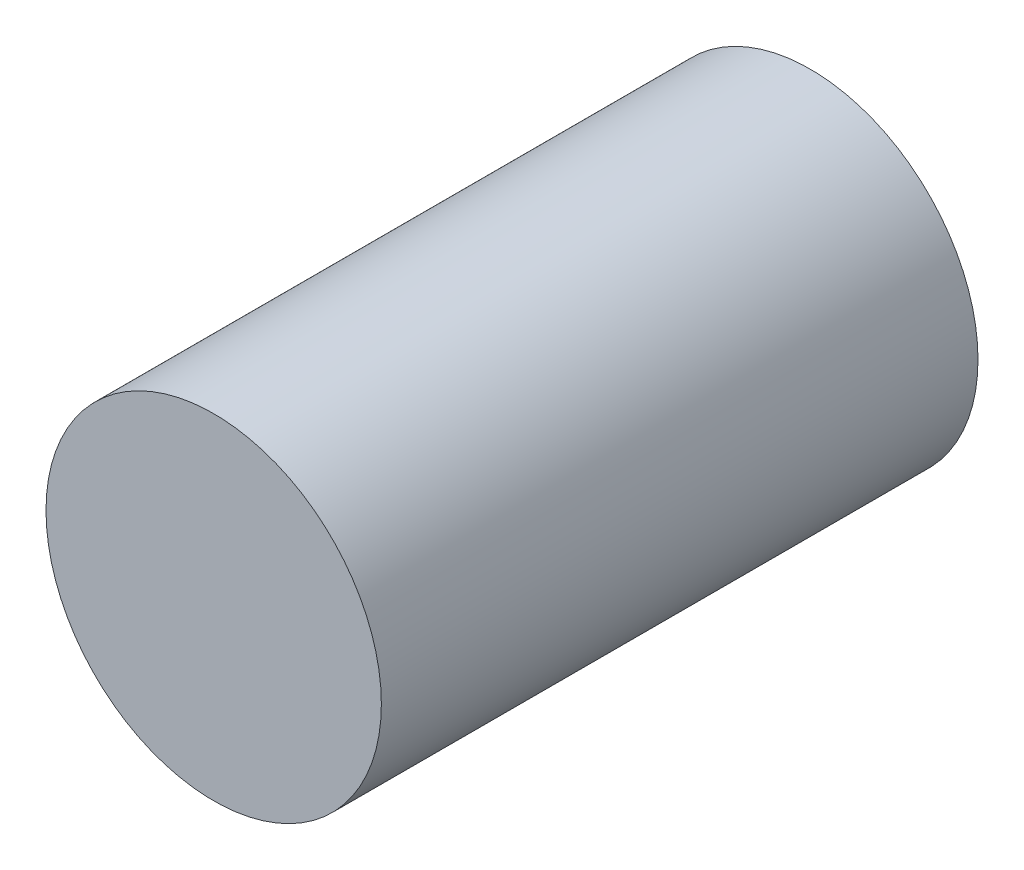
ISO-10303-21;
HEADER;
FILE_DESCRIPTION(('STEP AP214'),'2;1');
FILE_NAME('part.step','',(''),(''),'','','');
FILE_SCHEMA(('AUTOMOTIVE_DESIGN { 1 0 10303 214 1 1 1 1 }'));
ENDSEC;
DATA;
#1=APPLICATION_CONTEXT('core data for automotive mechanical design processes');
#2=APPLICATION_PROTOCOL_DEFINITION('international standard','automotive_design',2000,#1);
#3=PRODUCT_CONTEXT('',#1,'mechanical');
#4=PRODUCT('Part','Part','',(#3));
#5=PRODUCT_RELATED_PRODUCT_CATEGORY('part','',(#4));
#6=PRODUCT_DEFINITION_FORMATION('','',#4);
#7=PRODUCT_DEFINITION_CONTEXT('part definition',#1,'design');
#8=PRODUCT_DEFINITION('design','',#6,#7);
#9=PRODUCT_DEFINITION_SHAPE('','',#8);
#10=(LENGTH_UNIT() NAMED_UNIT(*) SI_UNIT(.MILLI.,.METRE.));
#11=(NAMED_UNIT(*) PLANE_ANGLE_UNIT() SI_UNIT($,.RADIAN.));
#12=(NAMED_UNIT(*) SI_UNIT($,.STERADIAN.) SOLID_ANGLE_UNIT());
#13=UNCERTAINTY_MEASURE_WITH_UNIT(LENGTH_MEASURE(1.E-05),#10,'distance_accuracy_value','');
#14=(GEOMETRIC_REPRESENTATION_CONTEXT(3) GLOBAL_UNCERTAINTY_ASSIGNED_CONTEXT((#13)) GLOBAL_UNIT_ASSIGNED_CONTEXT((#10,
#11,#12)) REPRESENTATION_CONTEXT('',''));
#15=CARTESIAN_POINT('',(0.,0.,0.));
#16=DIRECTION('',(0.,0.,1.));
#17=DIRECTION('',(1.,0.,0.));
#18=AXIS2_PLACEMENT_3D('',#15,#16,#17);
#19=CARTESIAN_POINT('',(0.,0.,13.5207248326412));
#20=DIRECTION('',(0.,0.,-1.));
#21=DIRECTION('',(-1.,0.,0.));
#22=AXIS2_PLACEMENT_3D('',#19,#20,#21);
#23=CYLINDRICAL_SURFACE('',#22,3.8);
#24=CARTESIAN_POINT('',(0.,0.,13.5207248326412));
#25=DIRECTION('',(0.,0.,1.));
#26=DIRECTION('',(1.,0.,0.));
#27=AXIS2_PLACEMENT_3D('',#24,#25,#26);
#28=CIRCLE('',#27,3.8);
#29=CARTESIAN_POINT('',(-3.8,0.,13.5207248326412));
#30=VERTEX_POINT('',#29);
#31=EDGE_CURVE('E10',#30,#30,#28,.T.);
#32=CARTESIAN_POINT('',(0.,0.,0.));
#33=DIRECTION('',(0.,0.,1.));
#34=DIRECTION('',(1.,0.,0.));
#35=AXIS2_PLACEMENT_3D('',#32,#33,#34);
#36=CIRCLE('',#35,3.8);
#37=CARTESIAN_POINT('',(-3.8,0.,0.));
#38=VERTEX_POINT('',#37);
#39=EDGE_CURVE('E40',#38,#38,#36,.T.);
#40=CARTESIAN_POINT('',(-3.8,0.,13.5207248326412));
#41=CARTESIAN_POINT('',(-3.8,0.,13.3798839489678));
#42=CARTESIAN_POINT('',(-3.8,0.,13.2390430652945));
#43=CARTESIAN_POINT('',(-3.8,0.,12.9573612979478));
#44=CARTESIAN_POINT('',(-3.8,0.,12.8165204142745));
#45=CARTESIAN_POINT('',(-3.8,0.,12.5348386469278));
#46=CARTESIAN_POINT('',(-3.8,0.,12.3939977632544));
#47=CARTESIAN_POINT('',(-3.8,0.,12.1123159959077));
#48=CARTESIAN_POINT('',(-3.8,0.,11.9714751122344));
#49=CARTESIAN_POINT('',(-3.8,0.,11.6897933448877));
#50=CARTESIAN_POINT('',(-3.8,0.,11.5489524612143));
#51=CARTESIAN_POINT('',(-3.8,0.,11.2672706938676));
#52=CARTESIAN_POINT('',(-3.8,0.,11.1264298101943));
#53=CARTESIAN_POINT('',(-3.8,0.,10.8447480428476));
#54=CARTESIAN_POINT('',(-3.8,0.,10.7039071591743));
#55=CARTESIAN_POINT('',(-3.8,0.,10.4222253918276));
#56=CARTESIAN_POINT('',(-3.8,0.,10.2813845081542));
#57=CARTESIAN_POINT('',(-3.8,0.,9.99970274080754));
#58=CARTESIAN_POINT('',(-3.8,0.,9.85886185713419));
#59=CARTESIAN_POINT('',(-3.8,0.,9.5771800897875));
#60=CARTESIAN_POINT('',(-3.8,0.,9.43633920611416));
#61=CARTESIAN_POINT('',(-3.8,0.,9.15465743876746));
#62=CARTESIAN_POINT('',(-3.8,0.,9.01381655509412));
#63=CARTESIAN_POINT('',(-3.8,0.,8.73213478774743));
#64=CARTESIAN_POINT('',(-3.8,0.,8.59129390407408));
#65=CARTESIAN_POINT('',(-3.8,0.,8.30961213672739));
#66=CARTESIAN_POINT('',(-3.8,0.,8.16877125305404));
#67=CARTESIAN_POINT('',(-3.8,0.,7.88708948570735));
#68=CARTESIAN_POINT('',(-3.8,0.,7.74624860203401));
#69=CARTESIAN_POINT('',(-3.8,0.,7.46456683468732));
#70=CARTESIAN_POINT('',(-3.8,0.,7.32372595101397));
#71=CARTESIAN_POINT('',(-3.8,0.,7.04204418366728));
#72=CARTESIAN_POINT('',(-3.8,0.,6.90120329999393));
#73=CARTESIAN_POINT('',(-3.8,0.,6.61952153264724));
#74=CARTESIAN_POINT('',(-3.8,0.,6.4786806489739));
#75=CARTESIAN_POINT('',(-3.8,0.,6.1969988816272));
#76=CARTESIAN_POINT('',(-3.8,0.,6.05615799795386));
#77=CARTESIAN_POINT('',(-3.8,0.,5.77447623060717));
#78=CARTESIAN_POINT('',(-3.8,0.,5.63363534693382));
#79=CARTESIAN_POINT('',(-3.8,0.,5.35195357958713));
#80=CARTESIAN_POINT('',(-3.8,0.,5.21111269591379));
#81=CARTESIAN_POINT('',(-3.8,0.,4.9294309285671));
#82=CARTESIAN_POINT('',(-3.8,0.,4.78859004489375));
#83=CARTESIAN_POINT('',(-3.8,0.,4.50690827754706));
#84=CARTESIAN_POINT('',(-3.8,0.,4.36606739387371));
#85=CARTESIAN_POINT('',(-3.8,0.,4.08438562652702));
#86=CARTESIAN_POINT('',(-3.8,0.,3.94354474285368));
#87=CARTESIAN_POINT('',(-3.8,0.,3.66186297550698));
#88=CARTESIAN_POINT('',(-3.8,0.,3.52102209183364));
#89=CARTESIAN_POINT('',(-3.8,0.,3.23934032448695));
#90=CARTESIAN_POINT('',(-3.8,0.,3.0984994408136));
#91=CARTESIAN_POINT('',(-3.8,0.,2.81681767346691));
#92=CARTESIAN_POINT('',(-3.8,0.,2.67597678979357));
#93=CARTESIAN_POINT('',(-3.8,0.,2.39429502244687));
#94=CARTESIAN_POINT('',(-3.8,0.,2.25345413877353));
#95=CARTESIAN_POINT('',(-3.8,0.,1.97177237142684));
#96=CARTESIAN_POINT('',(-3.8,0.,1.83093148775349));
#97=CARTESIAN_POINT('',(-3.8,0.,1.5492497204068));
#98=CARTESIAN_POINT('',(-3.8,0.,1.40840883673346));
#99=CARTESIAN_POINT('',(-3.8,0.,1.12672706938676));
#100=CARTESIAN_POINT('',(-3.8,0.,0.985886185713418));
#101=CARTESIAN_POINT('',(-3.8,0.,0.704204418366727));
#102=CARTESIAN_POINT('',(-3.8,0.,0.563363534693381));
#103=CARTESIAN_POINT('',(-3.8,0.,0.281681767346689));
#104=CARTESIAN_POINT('',(-3.8,0.,0.140840883673344));
#105=CARTESIAN_POINT('',(-3.8,0.,0.));
#106=B_SPLINE_CURVE_WITH_KNOTS('',3,(#40,#41,#42,#43,#44,#45,#46,#47,#48,#49,#50,#51,#52,#53,
#54,#55,#56,#57,#58,#59,#60,#61,#62,#63,#64,#65,#66,#67,#68,#69,#70,#71,#72,#73,#74,#75,#76,#77,
#78,#79,#80,#81,#82,#83,#84,#85,#86,#87,#88,#89,#90,#91,#92,#93,#94,#95,#96,#97,#98,#99,#100,
#101,#102,#103,#104,#105),.UNSPECIFIED.,.F.,.F.,(4,2,2,2,2,2,2,2,2,2,2,2,2,2,2,2,2,2,2,2,2,2,2,
2,2,2,2,2,2,2,2,2,4),(0.,0.422522651020038,0.845045302040074,1.26756795306011,1.69009060408015,
2.11261325510019,2.53513590612022,2.95765855714026,3.3801812081603,3.80270385918033,
4.22522651020037,4.64774916122041,5.07027181224044,5.49279446326048,5.91531711428052,
6.33783976530055,6.76036241632059,7.18288506734063,7.60540771836067,8.0279303693807,
8.45045302040074,8.87297567142078,9.29549832244081,9.71802097346085,10.1405436244809,
10.5630662755009,10.985588926521,11.408111577541,11.830634228561,12.2531568795811,
12.6756795306011,13.0982021816211,13.5207248326412),.UNSPECIFIED.);
#107=EDGE_CURVE('BSEAM37',#30,#38,#106,.T.);
#108=ORIENTED_EDGE('',*,*,#31,.F.);
#109=ORIENTED_EDGE('',*,*,#39,.T.);
#110=ORIENTED_EDGE('',*,*,#107,.T.);
#111=ORIENTED_EDGE('',*,*,#107,.F.);
#112=EDGE_LOOP('',(#108,#110,#109,#111));
#113=FACE_BOUND('',#112,.T.);
#114=ADVANCED_FACE('F37',(#113),#23,.T.);
#115=CARTESIAN_POINT('',(0.,0.,13.5207248326412));
#116=DIRECTION('',(0.,0.,1.));
#117=DIRECTION('',(1.,0.,0.));
#118=AXIS2_PLACEMENT_3D('',#115,#116,#117);
#119=PLANE('',#118);
#120=ORIENTED_EDGE('',*,*,#31,.T.);
#121=EDGE_LOOP('',(#120));
#122=FACE_BOUND('',#121,.T.);
#123=ADVANCED_FACE('F52',(#122),#119,.T.);
#124=CARTESIAN_POINT('',(0.,0.,0.));
#125=DIRECTION('',(0.,0.,1.));
#126=DIRECTION('',(1.,0.,0.));
#127=AXIS2_PLACEMENT_3D('',#124,#125,#126);
#128=PLANE('',#127);
#129=ORIENTED_EDGE('',*,*,#39,.F.);
#130=EDGE_LOOP('',(#129));
#131=FACE_BOUND('',#130,.T.);
#132=ADVANCED_FACE('F50',(#131),#128,.F.);
#133=CLOSED_SHELL('',(#114,#123,#132));
#134=MANIFOLD_SOLID_BREP('B2',#133);
#135=ADVANCED_BREP_SHAPE_REPRESENTATION('',(#18,#134),#14);
#136=SHAPE_DEFINITION_REPRESENTATION(#9,#135);
ENDSEC;
END-ISO-10303-21;
